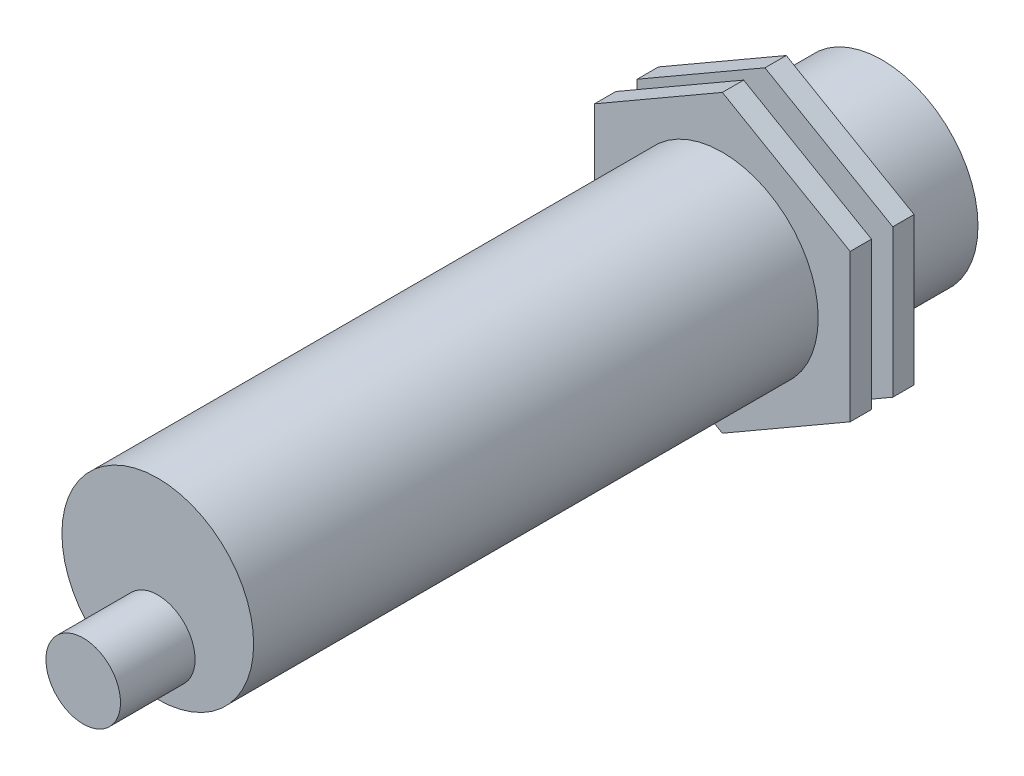
ISO-10303-21;
HEADER;
FILE_DESCRIPTION(('STEP AP214'),'2;1');
FILE_NAME('part.step','',(''),(''),'','','');
FILE_SCHEMA(('AUTOMOTIVE_DESIGN { 1 0 10303 214 1 1 1 1 }'));
ENDSEC;
DATA;
#1=APPLICATION_CONTEXT('core data for automotive mechanical design processes');
#2=APPLICATION_PROTOCOL_DEFINITION('international standard','automotive_design',2000,#1);
#3=PRODUCT_CONTEXT('',#1,'mechanical');
#4=PRODUCT('Part','Part','',(#3));
#5=PRODUCT_RELATED_PRODUCT_CATEGORY('part','',(#4));
#6=PRODUCT_DEFINITION_FORMATION('','',#4);
#7=PRODUCT_DEFINITION_CONTEXT('part definition',#1,'design');
#8=PRODUCT_DEFINITION('design','',#6,#7);
#9=PRODUCT_DEFINITION_SHAPE('','',#8);
#10=(LENGTH_UNIT() NAMED_UNIT(*) SI_UNIT(.MILLI.,.METRE.));
#11=(NAMED_UNIT(*) PLANE_ANGLE_UNIT() SI_UNIT($,.RADIAN.));
#12=(NAMED_UNIT(*) SI_UNIT($,.STERADIAN.) SOLID_ANGLE_UNIT());
#13=UNCERTAINTY_MEASURE_WITH_UNIT(LENGTH_MEASURE(1.E-05),#10,'distance_accuracy_value','');
#14=(GEOMETRIC_REPRESENTATION_CONTEXT(3) GLOBAL_UNCERTAINTY_ASSIGNED_CONTEXT((#13)) GLOBAL_UNIT_ASSIGNED_CONTEXT((#10,
#11,#12)) REPRESENTATION_CONTEXT('',''));
#15=CARTESIAN_POINT('',(0.,0.,0.));
#16=DIRECTION('',(0.,0.,1.));
#17=DIRECTION('',(1.,0.,0.));
#18=AXIS2_PLACEMENT_3D('',#15,#16,#17);
#19=CARTESIAN_POINT('',(0.,0.,68.));
#20=DIRECTION('',(0.,0.,-1.));
#21=DIRECTION('',(-1.,0.,0.));
#22=AXIS2_PLACEMENT_3D('',#19,#20,#21);
#23=CYLINDRICAL_SURFACE('',#22,9.);
#24=CARTESIAN_POINT('',(0.,0.,13.));
#25=DIRECTION('',(0.,0.,-1.));
#26=DIRECTION('',(-1.,0.,0.));
#27=AXIS2_PLACEMENT_3D('',#24,#25,#26);
#28=CIRCLE('',#27,9.);
#29=CARTESIAN_POINT('',(-9.,0.,13.));
#30=VERTEX_POINT('',#29);
#31=EDGE_CURVE('E47',#30,#30,#28,.T.);
#32=ORIENTED_EDGE('',*,*,#31,.T.);
#33=EDGE_LOOP('',(#32));
#34=FACE_BOUND('',#33,.T.);
#35=CARTESIAN_POINT('',(0.,0.,11.));
#36=DIRECTION('',(0.,0.,-1.));
#37=DIRECTION('',(-1.,0.,0.));
#38=AXIS2_PLACEMENT_3D('',#35,#36,#37);
#39=CIRCLE('',#38,9.);
#40=CARTESIAN_POINT('',(-9.,0.,11.));
#41=VERTEX_POINT('',#40);
#42=EDGE_CURVE('E54',#41,#41,#39,.T.);
#43=ORIENTED_EDGE('',*,*,#42,.F.);
#44=EDGE_LOOP('',(#43));
#45=FACE_BOUND('',#44,.T.);
#46=ADVANCED_FACE('F43',(#34,#45),#23,.T.);
#47=CARTESIAN_POINT('',(0.,13.856406460551,11.));
#48=DIRECTION('',(0.499999999999998,0.86602540378444,0.));
#49=DIRECTION('',(-0.86602540378444,0.499999999999998,0.));
#50=AXIS2_PLACEMENT_3D('',#47,#48,#49);
#51=PLANE('',#50);
#52=DIRECTION('',(0.86602540378444,-0.499999999999998,0.));
#53=VECTOR('',#52,1.);
#54=CARTESIAN_POINT('',(0.,13.856406460551,9.));
#55=LINE('',#54,#53);
#56=CARTESIAN_POINT('',(0.,13.856406460551,9.));
#57=VERTEX_POINT('',#56);
#58=CARTESIAN_POINT('',(12.,6.92820323027549,9.));
#59=VERTEX_POINT('',#58);
#60=EDGE_CURVE('E142',#57,#59,#55,.T.);
#61=ORIENTED_EDGE('',*,*,#60,.F.);
#62=DIRECTION('',(0.,0.,-1.));
#63=VECTOR('',#62,1.);
#64=CARTESIAN_POINT('',(0.,13.856406460551,11.));
#65=LINE('',#64,#63);
#66=CARTESIAN_POINT('',(0.,13.856406460551,11.));
#67=VERTEX_POINT('',#66);
#68=EDGE_CURVE('E62',#67,#57,#65,.T.);
#69=ORIENTED_EDGE('',*,*,#68,.F.);
#70=DIRECTION('',(0.86602540378444,-0.499999999999998,0.));
#71=VECTOR('',#70,1.);
#72=CARTESIAN_POINT('',(0.,13.856406460551,11.));
#73=LINE('',#72,#71);
#74=CARTESIAN_POINT('',(12.,6.92820323027549,11.));
#75=VERTEX_POINT('',#74);
#76=EDGE_CURVE('E163',#67,#75,#73,.T.);
#77=ORIENTED_EDGE('',*,*,#76,.T.);
#78=DIRECTION('',(0.,0.,-1.));
#79=VECTOR('',#78,1.);
#80=CARTESIAN_POINT('',(12.,6.92820323027549,11.));
#81=LINE('',#80,#79);
#82=EDGE_CURVE('E98',#75,#59,#81,.T.);
#83=ORIENTED_EDGE('',*,*,#82,.T.);
#84=EDGE_LOOP('',(#61,#69,#77,#83));
#85=FACE_BOUND('',#84,.T.);
#86=ADVANCED_FACE('F201',(#85),#51,.T.);
#87=CARTESIAN_POINT('',(-12.,6.9282032302755,11.));
#88=DIRECTION('',(-0.499999999999997,0.86602540378444,0.));
#89=DIRECTION('',(-0.86602540378444,-0.499999999999997,0.));
#90=AXIS2_PLACEMENT_3D('',#87,#88,#89);
#91=PLANE('',#90);
#92=DIRECTION('',(0.86602540378444,0.499999999999997,0.));
#93=VECTOR('',#92,1.);
#94=CARTESIAN_POINT('',(-12.,6.9282032302755,9.));
#95=LINE('',#94,#93);
#96=CARTESIAN_POINT('',(-12.,6.9282032302755,9.));
#97=VERTEX_POINT('',#96);
#98=EDGE_CURVE('E159',#97,#57,#95,.T.);
#99=ORIENTED_EDGE('',*,*,#98,.F.);
#100=DIRECTION('',(0.,0.,-1.));
#101=VECTOR('',#100,1.);
#102=CARTESIAN_POINT('',(-12.,6.9282032302755,11.));
#103=LINE('',#102,#101);
#104=CARTESIAN_POINT('',(-12.,6.9282032302755,11.));
#105=VERTEX_POINT('',#104);
#106=EDGE_CURVE('E86',#105,#97,#103,.T.);
#107=ORIENTED_EDGE('',*,*,#106,.F.);
#108=DIRECTION('',(0.86602540378444,0.499999999999997,0.));
#109=VECTOR('',#108,1.);
#110=CARTESIAN_POINT('',(-12.,6.9282032302755,11.));
#111=LINE('',#110,#109);
#112=EDGE_CURVE('E128',#105,#67,#111,.T.);
#113=ORIENTED_EDGE('',*,*,#112,.T.);
#114=ORIENTED_EDGE('',*,*,#68,.T.);
#115=EDGE_LOOP('',(#99,#107,#113,#114));
#116=FACE_BOUND('',#115,.T.);
#117=ADVANCED_FACE('F209',(#116),#91,.T.);
#118=CARTESIAN_POINT('',(-12.,-6.92820323027549,11.));
#119=DIRECTION('',(-1.,0.,0.));
#120=DIRECTION('',(0.,0.,1.));
#121=AXIS2_PLACEMENT_3D('',#118,#119,#120);
#122=PLANE('',#121);
#123=DIRECTION('',(0.,1.,0.));
#124=VECTOR('',#123,1.);
#125=CARTESIAN_POINT('',(-12.,-6.92820323027549,9.));
#126=LINE('',#125,#124);
#127=CARTESIAN_POINT('',(-12.,-6.92820323027549,9.));
#128=VERTEX_POINT('',#127);
#129=EDGE_CURVE('E114',#128,#97,#126,.T.);
#130=ORIENTED_EDGE('',*,*,#129,.F.);
#131=DIRECTION('',(0.,0.,-1.));
#132=VECTOR('',#131,1.);
#133=CARTESIAN_POINT('',(-12.,-6.92820323027549,11.));
#134=LINE('',#133,#132);
#135=CARTESIAN_POINT('',(-12.,-6.92820323027549,11.));
#136=VERTEX_POINT('',#135);
#137=EDGE_CURVE('E109',#136,#128,#134,.T.);
#138=ORIENTED_EDGE('',*,*,#137,.F.);
#139=DIRECTION('',(0.,1.,0.));
#140=VECTOR('',#139,1.);
#141=CARTESIAN_POINT('',(-12.,-6.92820323027549,11.));
#142=LINE('',#141,#140);
#143=EDGE_CURVE('E112',#136,#105,#142,.T.);
#144=ORIENTED_EDGE('',*,*,#143,.T.);
#145=ORIENTED_EDGE('',*,*,#106,.T.);
#146=EDGE_LOOP('',(#130,#138,#144,#145));
#147=FACE_BOUND('',#146,.T.);
#148=ADVANCED_FACE('F111',(#147),#122,.T.);
#149=CARTESIAN_POINT('',(0.,-13.856406460551,11.));
#150=DIRECTION('',(-0.499999999999998,-0.86602540378444,0.));
#151=DIRECTION('',(0.86602540378444,-0.499999999999998,0.));
#152=AXIS2_PLACEMENT_3D('',#149,#150,#151);
#153=PLANE('',#152);
#154=DIRECTION('',(-0.86602540378444,0.499999999999998,0.));
#155=VECTOR('',#154,1.);
#156=CARTESIAN_POINT('',(0.,-13.856406460551,9.));
#157=LINE('',#156,#155);
#158=CARTESIAN_POINT('',(0.,-13.856406460551,9.));
#159=VERTEX_POINT('',#158);
#160=EDGE_CURVE('E154',#159,#128,#157,.T.);
#161=ORIENTED_EDGE('',*,*,#160,.F.);
#162=DIRECTION('',(0.,0.,-1.));
#163=VECTOR('',#162,1.);
#164=CARTESIAN_POINT('',(0.,-13.856406460551,11.));
#165=LINE('',#164,#163);
#166=CARTESIAN_POINT('',(0.,-13.856406460551,11.));
#167=VERTEX_POINT('',#166);
#168=EDGE_CURVE('E120',#167,#159,#165,.T.);
#169=ORIENTED_EDGE('',*,*,#168,.F.);
#170=DIRECTION('',(-0.86602540378444,0.499999999999998,0.));
#171=VECTOR('',#170,1.);
#172=CARTESIAN_POINT('',(0.,-13.856406460551,11.));
#173=LINE('',#172,#171);
#174=EDGE_CURVE('E126',#167,#136,#173,.T.);
#175=ORIENTED_EDGE('',*,*,#174,.T.);
#176=ORIENTED_EDGE('',*,*,#137,.T.);
#177=EDGE_LOOP('',(#161,#169,#175,#176));
#178=FACE_BOUND('',#177,.T.);
#179=ADVANCED_FACE('F131',(#178),#153,.T.);
#180=CARTESIAN_POINT('',(12.,-6.9282032302755,11.));
#181=DIRECTION('',(0.499999999999997,-0.86602540378444,0.));
#182=DIRECTION('',(0.86602540378444,0.499999999999997,0.));
#183=AXIS2_PLACEMENT_3D('',#180,#181,#182);
#184=PLANE('',#183);
#185=DIRECTION('',(-0.86602540378444,-0.499999999999997,0.));
#186=VECTOR('',#185,1.);
#187=CARTESIAN_POINT('',(12.,-6.9282032302755,9.));
#188=LINE('',#187,#186);
#189=CARTESIAN_POINT('',(12.,-6.9282032302755,9.));
#190=VERTEX_POINT('',#189);
#191=EDGE_CURVE('E150',#190,#159,#188,.T.);
#192=ORIENTED_EDGE('',*,*,#191,.F.);
#193=DIRECTION('',(0.,0.,-1.));
#194=VECTOR('',#193,1.);
#195=CARTESIAN_POINT('',(12.,-6.9282032302755,11.));
#196=LINE('',#195,#194);
#197=CARTESIAN_POINT('',(12.,-6.9282032302755,11.));
#198=VERTEX_POINT('',#197);
#199=EDGE_CURVE('E171',#198,#190,#196,.T.);
#200=ORIENTED_EDGE('',*,*,#199,.F.);
#201=DIRECTION('',(-0.86602540378444,-0.499999999999997,0.));
#202=VECTOR('',#201,1.);
#203=CARTESIAN_POINT('',(12.,-6.9282032302755,11.));
#204=LINE('',#203,#202);
#205=EDGE_CURVE('E133',#198,#167,#204,.T.);
#206=ORIENTED_EDGE('',*,*,#205,.T.);
#207=ORIENTED_EDGE('',*,*,#168,.T.);
#208=EDGE_LOOP('',(#192,#200,#206,#207));
#209=FACE_BOUND('',#208,.T.);
#210=ADVANCED_FACE('F315',(#209),#184,.T.);
#211=CARTESIAN_POINT('',(12.,6.92820323027549,11.));
#212=DIRECTION('',(1.,0.,0.));
#213=DIRECTION('',(0.,0.,-1.));
#214=AXIS2_PLACEMENT_3D('',#211,#212,#213);
#215=PLANE('',#214);
#216=DIRECTION('',(0.,-1.,0.));
#217=VECTOR('',#216,1.);
#218=CARTESIAN_POINT('',(12.,6.92820323027549,9.));
#219=LINE('',#218,#217);
#220=EDGE_CURVE('E146',#59,#190,#219,.T.);
#221=ORIENTED_EDGE('',*,*,#220,.F.);
#222=ORIENTED_EDGE('',*,*,#82,.F.);
#223=DIRECTION('',(0.,-1.,0.));
#224=VECTOR('',#223,1.);
#225=CARTESIAN_POINT('',(12.,6.92820323027549,11.));
#226=LINE('',#225,#224);
#227=EDGE_CURVE('E136',#75,#198,#226,.T.);
#228=ORIENTED_EDGE('',*,*,#227,.T.);
#229=ORIENTED_EDGE('',*,*,#199,.T.);
#230=EDGE_LOOP('',(#221,#222,#228,#229));
#231=FACE_BOUND('',#230,.T.);
#232=ADVANCED_FACE('F300',(#231),#215,.T.);
#233=CARTESIAN_POINT('',(0.,0.,11.));
#234=DIRECTION('',(0.,0.,-1.));
#235=DIRECTION('',(-1.,0.,0.));
#236=AXIS2_PLACEMENT_3D('',#233,#234,#235);
#237=PLANE('',#236);
#238=ORIENTED_EDGE('',*,*,#42,.T.);
#239=EDGE_LOOP('',(#238));
#240=FACE_BOUND('',#239,.T.);
#241=ORIENTED_EDGE('',*,*,#76,.F.);
#242=ORIENTED_EDGE('',*,*,#112,.F.);
#243=ORIENTED_EDGE('',*,*,#143,.F.);
#244=ORIENTED_EDGE('',*,*,#174,.F.);
#245=ORIENTED_EDGE('',*,*,#205,.F.);
#246=ORIENTED_EDGE('',*,*,#227,.F.);
#247=EDGE_LOOP('',(#241,#242,#243,#244,#245,#246));
#248=FACE_BOUND('',#247,.T.);
#249=ADVANCED_FACE('F124',(#240,#248),#237,.F.);
#250=CARTESIAN_POINT('',(0.,0.,9.));
#251=DIRECTION('',(0.,0.,-1.));
#252=DIRECTION('',(-1.,0.,0.));
#253=AXIS2_PLACEMENT_3D('',#250,#251,#252);
#254=PLANE('',#253);
#255=CARTESIAN_POINT('',(0.,0.,9.));
#256=DIRECTION('',(0.,0.,-1.));
#257=DIRECTION('',(-1.,0.,0.));
#258=AXIS2_PLACEMENT_3D('',#255,#256,#257);
#259=CIRCLE('',#258,9.);
#260=CARTESIAN_POINT('',(-9.,0.,9.));
#261=VERTEX_POINT('',#260);
#262=EDGE_CURVE('E166',#261,#261,#259,.T.);
#263=ORIENTED_EDGE('',*,*,#262,.F.);
#264=EDGE_LOOP('',(#263));
#265=FACE_BOUND('',#264,.T.);
#266=ORIENTED_EDGE('',*,*,#60,.T.);
#267=ORIENTED_EDGE('',*,*,#220,.T.);
#268=ORIENTED_EDGE('',*,*,#191,.T.);
#269=ORIENTED_EDGE('',*,*,#160,.T.);
#270=ORIENTED_EDGE('',*,*,#129,.T.);
#271=ORIENTED_EDGE('',*,*,#98,.T.);
#272=EDGE_LOOP('',(#266,#267,#268,#269,#270,#271));
#273=FACE_BOUND('',#272,.T.);
#274=ADVANCED_FACE('F303',(#265,#273),#254,.T.);
#275=CARTESIAN_POINT('',(0.,0.,0.));
#276=DIRECTION('',(0.,0.,1.));
#277=DIRECTION('',(1.,0.,0.));
#278=AXIS2_PLACEMENT_3D('',#275,#276,#277);
#279=PLANE('',#278);
#280=CARTESIAN_POINT('',(0.,0.,0.));
#281=DIRECTION('',(0.,0.,1.));
#282=DIRECTION('',(1.,0.,0.));
#283=AXIS2_PLACEMENT_3D('',#280,#281,#282);
#284=CIRCLE('',#283,9.);
#285=CARTESIAN_POINT('',(9.,0.,0.));
#286=VERTEX_POINT('',#285);
#287=EDGE_CURVE('E180',#286,#286,#284,.T.);
#288=ORIENTED_EDGE('',*,*,#287,.F.);
#289=EDGE_LOOP('',(#288));
#290=FACE_BOUND('',#289,.T.);
#291=ADVANCED_FACE('F213',(#290),#279,.F.);
#292=ORIENTED_EDGE('',*,*,#262,.T.);
#293=EDGE_LOOP('',(#292));
#294=FACE_BOUND('',#293,.T.);
#295=ORIENTED_EDGE('',*,*,#287,.T.);
#296=EDGE_LOOP('',(#295));
#297=FACE_BOUND('',#296,.T.);
#298=ADVANCED_FACE('F45',(#294,#297),#23,.T.);
#299=CARTESIAN_POINT('',(0.,13.856406460551,13.));
#300=DIRECTION('',(-0.499999999999998,-0.86602540378444,0.));
#301=DIRECTION('',(0.86602540378444,-0.499999999999998,0.));
#302=AXIS2_PLACEMENT_3D('',#299,#300,#301);
#303=PLANE('',#302);
#304=DIRECTION('',(0.86602540378444,-0.499999999999998,0.));
#305=VECTOR('',#304,1.);
#306=CARTESIAN_POINT('',(0.,13.856406460551,15.));
#307=LINE('',#306,#305);
#308=CARTESIAN_POINT('',(0.,13.856406460551,15.));
#309=VERTEX_POINT('',#308);
#310=CARTESIAN_POINT('',(12.,6.92820323027549,15.));
#311=VERTEX_POINT('',#310);
#312=EDGE_CURVE('E239',#309,#311,#307,.T.);
#313=ORIENTED_EDGE('',*,*,#312,.T.);
#314=DIRECTION('',(0.,0.,1.));
#315=VECTOR('',#314,1.);
#316=CARTESIAN_POINT('',(12.,6.92820323027549,13.));
#317=LINE('',#316,#315);
#318=CARTESIAN_POINT('',(12.,6.92820323027549,13.));
#319=VERTEX_POINT('',#318);
#320=EDGE_CURVE('E295',#319,#311,#317,.T.);
#321=ORIENTED_EDGE('',*,*,#320,.F.);
#322=DIRECTION('',(0.86602540378444,-0.499999999999998,0.));
#323=VECTOR('',#322,1.);
#324=CARTESIAN_POINT('',(0.,13.856406460551,13.));
#325=LINE('',#324,#323);
#326=CARTESIAN_POINT('',(0.,13.856406460551,13.));
#327=VERTEX_POINT('',#326);
#328=EDGE_CURVE('E275',#327,#319,#325,.T.);
#329=ORIENTED_EDGE('',*,*,#328,.F.);
#330=DIRECTION('',(0.,0.,1.));
#331=VECTOR('',#330,1.);
#332=CARTESIAN_POINT('',(0.,13.856406460551,13.));
#333=LINE('',#332,#331);
#334=EDGE_CURVE('E276',#327,#309,#333,.T.);
#335=ORIENTED_EDGE('',*,*,#334,.T.);
#336=EDGE_LOOP('',(#313,#321,#329,#335));
#337=FACE_BOUND('',#336,.T.);
#338=ADVANCED_FACE('F212',(#337),#303,.F.);
#339=CARTESIAN_POINT('',(12.,6.92820323027549,13.));
#340=DIRECTION('',(-1.,0.,0.));
#341=DIRECTION('',(0.,0.,1.));
#342=AXIS2_PLACEMENT_3D('',#339,#340,#341);
#343=PLANE('',#342);
#344=DIRECTION('',(0.,-1.,0.));
#345=VECTOR('',#344,1.);
#346=CARTESIAN_POINT('',(12.,6.92820323027549,15.));
#347=LINE('',#346,#345);
#348=CARTESIAN_POINT('',(12.,-6.9282032302755,15.));
#349=VERTEX_POINT('',#348);
#350=EDGE_CURVE('E247',#311,#349,#347,.T.);
#351=ORIENTED_EDGE('',*,*,#350,.T.);
#352=DIRECTION('',(0.,0.,1.));
#353=VECTOR('',#352,1.);
#354=CARTESIAN_POINT('',(12.,-6.9282032302755,13.));
#355=LINE('',#354,#353);
#356=CARTESIAN_POINT('',(12.,-6.9282032302755,13.));
#357=VERTEX_POINT('',#356);
#358=EDGE_CURVE('E291',#357,#349,#355,.T.);
#359=ORIENTED_EDGE('',*,*,#358,.F.);
#360=DIRECTION('',(0.,-1.,0.));
#361=VECTOR('',#360,1.);
#362=CARTESIAN_POINT('',(12.,6.92820323027549,13.));
#363=LINE('',#362,#361);
#364=EDGE_CURVE('E376',#319,#357,#363,.T.);
#365=ORIENTED_EDGE('',*,*,#364,.F.);
#366=ORIENTED_EDGE('',*,*,#320,.T.);
#367=EDGE_LOOP('',(#351,#359,#365,#366));
#368=FACE_BOUND('',#367,.T.);
#369=ADVANCED_FACE('F343',(#368),#343,.F.);
#370=CARTESIAN_POINT('',(12.,-6.9282032302755,13.));
#371=DIRECTION('',(-0.499999999999997,0.86602540378444,0.));
#372=DIRECTION('',(-0.86602540378444,-0.499999999999997,0.));
#373=AXIS2_PLACEMENT_3D('',#370,#371,#372);
#374=PLANE('',#373);
#375=DIRECTION('',(-0.86602540378444,-0.499999999999997,0.));
#376=VECTOR('',#375,1.);
#377=CARTESIAN_POINT('',(12.,-6.9282032302755,15.));
#378=LINE('',#377,#376);
#379=CARTESIAN_POINT('',(0.,-13.856406460551,15.));
#380=VERTEX_POINT('',#379);
#381=EDGE_CURVE('E256',#349,#380,#378,.T.);
#382=ORIENTED_EDGE('',*,*,#381,.T.);
#383=DIRECTION('',(0.,0.,1.));
#384=VECTOR('',#383,1.);
#385=CARTESIAN_POINT('',(0.,-13.856406460551,13.));
#386=LINE('',#385,#384);
#387=CARTESIAN_POINT('',(0.,-13.856406460551,13.));
#388=VERTEX_POINT('',#387);
#389=EDGE_CURVE('E287',#388,#380,#386,.T.);
#390=ORIENTED_EDGE('',*,*,#389,.F.);
#391=DIRECTION('',(-0.86602540378444,-0.499999999999997,0.));
#392=VECTOR('',#391,1.);
#393=CARTESIAN_POINT('',(12.,-6.9282032302755,13.));
#394=LINE('',#393,#392);
#395=EDGE_CURVE('E405',#357,#388,#394,.T.);
#396=ORIENTED_EDGE('',*,*,#395,.F.);
#397=ORIENTED_EDGE('',*,*,#358,.T.);
#398=EDGE_LOOP('',(#382,#390,#396,#397));
#399=FACE_BOUND('',#398,.T.);
#400=ADVANCED_FACE('F346',(#399),#374,.F.);
#401=CARTESIAN_POINT('',(0.,-13.856406460551,13.));
#402=DIRECTION('',(0.499999999999998,0.86602540378444,0.));
#403=DIRECTION('',(-0.86602540378444,0.499999999999998,0.));
#404=AXIS2_PLACEMENT_3D('',#401,#402,#403);
#405=PLANE('',#404);
#406=DIRECTION('',(-0.86602540378444,0.499999999999998,0.));
#407=VECTOR('',#406,1.);
#408=CARTESIAN_POINT('',(0.,-13.856406460551,15.));
#409=LINE('',#408,#407);
#410=CARTESIAN_POINT('',(-12.,-6.92820323027549,15.));
#411=VERTEX_POINT('',#410);
#412=EDGE_CURVE('E265',#380,#411,#409,.T.);
#413=ORIENTED_EDGE('',*,*,#412,.T.);
#414=DIRECTION('',(0.,0.,1.));
#415=VECTOR('',#414,1.);
#416=CARTESIAN_POINT('',(-12.,-6.92820323027549,13.));
#417=LINE('',#416,#415);
#418=CARTESIAN_POINT('',(-12.,-6.92820323027549,13.));
#419=VERTEX_POINT('',#418);
#420=EDGE_CURVE('E283',#419,#411,#417,.T.);
#421=ORIENTED_EDGE('',*,*,#420,.F.);
#422=DIRECTION('',(-0.86602540378444,0.499999999999998,0.));
#423=VECTOR('',#422,1.);
#424=CARTESIAN_POINT('',(0.,-13.856406460551,13.));
#425=LINE('',#424,#423);
#426=EDGE_CURVE('E402',#388,#419,#425,.T.);
#427=ORIENTED_EDGE('',*,*,#426,.F.);
#428=ORIENTED_EDGE('',*,*,#389,.T.);
#429=EDGE_LOOP('',(#413,#421,#427,#428));
#430=FACE_BOUND('',#429,.T.);
#431=ADVANCED_FACE('F350',(#430),#405,.F.);
#432=CARTESIAN_POINT('',(-12.,-6.92820323027549,13.));
#433=DIRECTION('',(1.,0.,0.));
#434=DIRECTION('',(0.,0.,-1.));
#435=AXIS2_PLACEMENT_3D('',#432,#433,#434);
#436=PLANE('',#435);
#437=DIRECTION('',(0.,1.,0.));
#438=VECTOR('',#437,1.);
#439=CARTESIAN_POINT('',(-12.,-6.92820323027549,15.));
#440=LINE('',#439,#438);
#441=CARTESIAN_POINT('',(-12.,6.9282032302755,15.));
#442=VERTEX_POINT('',#441);
#443=EDGE_CURVE('E269',#411,#442,#440,.T.);
#444=ORIENTED_EDGE('',*,*,#443,.T.);
#445=DIRECTION('',(0.,0.,1.));
#446=VECTOR('',#445,1.);
#447=CARTESIAN_POINT('',(-12.,6.9282032302755,13.));
#448=LINE('',#447,#446);
#449=CARTESIAN_POINT('',(-12.,6.9282032302755,13.));
#450=VERTEX_POINT('',#449);
#451=EDGE_CURVE('E279',#450,#442,#448,.T.);
#452=ORIENTED_EDGE('',*,*,#451,.F.);
#453=DIRECTION('',(0.,1.,0.));
#454=VECTOR('',#453,1.);
#455=CARTESIAN_POINT('',(-12.,-6.92820323027549,13.));
#456=LINE('',#455,#454);
#457=EDGE_CURVE('E400',#419,#450,#456,.T.);
#458=ORIENTED_EDGE('',*,*,#457,.F.);
#459=ORIENTED_EDGE('',*,*,#420,.T.);
#460=EDGE_LOOP('',(#444,#452,#458,#459));
#461=FACE_BOUND('',#460,.T.);
#462=ADVANCED_FACE('F354',(#461),#436,.F.);
#463=CARTESIAN_POINT('',(-12.,6.9282032302755,13.));
#464=DIRECTION('',(0.499999999999997,-0.86602540378444,0.));
#465=DIRECTION('',(0.86602540378444,0.499999999999997,0.));
#466=AXIS2_PLACEMENT_3D('',#463,#464,#465);
#467=PLANE('',#466);
#468=DIRECTION('',(0.86602540378444,0.499999999999997,0.));
#469=VECTOR('',#468,1.);
#470=CARTESIAN_POINT('',(-12.,6.9282032302755,15.));
#471=LINE('',#470,#469);
#472=EDGE_CURVE('E243',#442,#309,#471,.T.);
#473=ORIENTED_EDGE('',*,*,#472,.T.);
#474=ORIENTED_EDGE('',*,*,#334,.F.);
#475=DIRECTION('',(0.86602540378444,0.499999999999997,0.));
#476=VECTOR('',#475,1.);
#477=CARTESIAN_POINT('',(-12.,6.9282032302755,13.));
#478=LINE('',#477,#476);
#479=EDGE_CURVE('E259',#450,#327,#478,.T.);
#480=ORIENTED_EDGE('',*,*,#479,.F.);
#481=ORIENTED_EDGE('',*,*,#451,.T.);
#482=EDGE_LOOP('',(#473,#474,#480,#481));
#483=FACE_BOUND('',#482,.T.);
#484=ADVANCED_FACE('F358',(#483),#467,.F.);
#485=CARTESIAN_POINT('',(0.,0.,13.));
#486=DIRECTION('',(0.,0.,-1.));
#487=DIRECTION('',(-1.,0.,0.));
#488=AXIS2_PLACEMENT_3D('',#485,#486,#487);
#489=PLANE('',#488);
#490=ORIENTED_EDGE('',*,*,#31,.F.);
#491=EDGE_LOOP('',(#490));
#492=FACE_BOUND('',#491,.T.);
#493=ORIENTED_EDGE('',*,*,#328,.T.);
#494=ORIENTED_EDGE('',*,*,#364,.T.);
#495=ORIENTED_EDGE('',*,*,#395,.T.);
#496=ORIENTED_EDGE('',*,*,#426,.T.);
#497=ORIENTED_EDGE('',*,*,#457,.T.);
#498=ORIENTED_EDGE('',*,*,#479,.T.);
#499=EDGE_LOOP('',(#493,#494,#495,#496,#497,#498));
#500=FACE_BOUND('',#499,.T.);
#501=ADVANCED_FACE('F233',(#492,#500),#489,.T.);
#502=CARTESIAN_POINT('',(0.,0.,15.));
#503=DIRECTION('',(0.,0.,-1.));
#504=DIRECTION('',(-1.,0.,0.));
#505=AXIS2_PLACEMENT_3D('',#502,#503,#504);
#506=PLANE('',#505);
#507=CARTESIAN_POINT('',(0.,0.,15.));
#508=DIRECTION('',(0.,0.,-1.));
#509=DIRECTION('',(-1.,0.,0.));
#510=AXIS2_PLACEMENT_3D('',#507,#508,#509);
#511=CIRCLE('',#510,9.);
#512=CARTESIAN_POINT('',(-9.,0.,15.));
#513=VERTEX_POINT('',#512);
#514=EDGE_CURVE('E11',#513,#513,#511,.T.);
#515=ORIENTED_EDGE('',*,*,#514,.T.);
#516=EDGE_LOOP('',(#515));
#517=FACE_BOUND('',#516,.T.);
#518=ORIENTED_EDGE('',*,*,#312,.F.);
#519=ORIENTED_EDGE('',*,*,#472,.F.);
#520=ORIENTED_EDGE('',*,*,#443,.F.);
#521=ORIENTED_EDGE('',*,*,#412,.F.);
#522=ORIENTED_EDGE('',*,*,#381,.F.);
#523=ORIENTED_EDGE('',*,*,#350,.F.);
#524=EDGE_LOOP('',(#518,#519,#520,#521,#522,#523));
#525=FACE_BOUND('',#524,.T.);
#526=ADVANCED_FACE('F229',(#517,#525),#506,.F.);
#527=CARTESIAN_POINT('',(0.,-4.,75.));
#528=DIRECTION('',(0.,0.,1.));
#529=DIRECTION('',(1.,0.,0.));
#530=AXIS2_PLACEMENT_3D('',#527,#528,#529);
#531=PLANE('',#530);
#532=CARTESIAN_POINT('',(0.,-4.,75.));
#533=DIRECTION('',(0.,0.,1.));
#534=DIRECTION('',(1.,0.,0.));
#535=AXIS2_PLACEMENT_3D('',#532,#533,#534);
#536=CIRCLE('',#535,3.5);
#537=CARTESIAN_POINT('',(3.5,-4.,75.));
#538=VERTEX_POINT('',#537);
#539=EDGE_CURVE('E176',#538,#538,#536,.T.);
#540=ORIENTED_EDGE('',*,*,#539,.T.);
#541=EDGE_LOOP('',(#540));
#542=FACE_BOUND('',#541,.T.);
#543=ADVANCED_FACE('F232',(#542),#531,.T.);
#544=CARTESIAN_POINT('',(0.,-4.,75.));
#545=DIRECTION('',(0.,0.,-1.));
#546=DIRECTION('',(-1.,0.,0.));
#547=AXIS2_PLACEMENT_3D('',#544,#545,#546);
#548=CYLINDRICAL_SURFACE('',#547,3.5);
#549=ORIENTED_EDGE('',*,*,#539,.F.);
#550=EDGE_LOOP('',(#549));
#551=FACE_BOUND('',#550,.T.);
#552=CARTESIAN_POINT('',(0.,-4.,68.));
#553=DIRECTION('',(0.,0.,1.));
#554=DIRECTION('',(1.,0.,0.));
#555=AXIS2_PLACEMENT_3D('',#552,#553,#554);
#556=CIRCLE('',#555,3.5);
#557=CARTESIAN_POINT('',(3.5,-4.,68.));
#558=VERTEX_POINT('',#557);
#559=EDGE_CURVE('E181',#558,#558,#556,.T.);
#560=ORIENTED_EDGE('',*,*,#559,.T.);
#561=EDGE_LOOP('',(#560));
#562=FACE_BOUND('',#561,.T.);
#563=ADVANCED_FACE('F222',(#551,#562),#548,.T.);
#564=CARTESIAN_POINT('',(0.,0.,68.));
#565=DIRECTION('',(0.,0.,1.));
#566=DIRECTION('',(1.,0.,0.));
#567=AXIS2_PLACEMENT_3D('',#564,#565,#566);
#568=PLANE('',#567);
#569=ORIENTED_EDGE('',*,*,#559,.F.);
#570=EDGE_LOOP('',(#569));
#571=FACE_BOUND('',#570,.T.);
#572=CARTESIAN_POINT('',(0.,0.,68.));
#573=DIRECTION('',(0.,0.,1.));
#574=DIRECTION('',(1.,0.,0.));
#575=AXIS2_PLACEMENT_3D('',#572,#573,#574);
#576=CIRCLE('',#575,9.);
#577=CARTESIAN_POINT('',(9.,0.,68.));
#578=VERTEX_POINT('',#577);
#579=EDGE_CURVE('E185',#578,#578,#576,.T.);
#580=ORIENTED_EDGE('',*,*,#579,.T.);
#581=EDGE_LOOP('',(#580));
#582=FACE_BOUND('',#581,.T.);
#583=ADVANCED_FACE('F216',(#571,#582),#568,.T.);
#584=ORIENTED_EDGE('',*,*,#579,.F.);
#585=EDGE_LOOP('',(#584));
#586=FACE_BOUND('',#585,.T.);
#587=ORIENTED_EDGE('',*,*,#514,.F.);
#588=EDGE_LOOP('',(#587));
#589=FACE_BOUND('',#588,.T.);
#590=ADVANCED_FACE('F203',(#586,#589),#23,.T.);
#591=CLOSED_SHELL('',(#46,#86,#117,#148,#179,#210,#232,#249,#274,#291,#298,#338,#369,#400,#431,
#462,#484,#501,#526,#543,#563,#583,#590));
#592=MANIFOLD_SOLID_BREP('B2',#591);
#593=ADVANCED_BREP_SHAPE_REPRESENTATION('',(#18,#592),#14);
#594=SHAPE_DEFINITION_REPRESENTATION(#9,#593);
ENDSEC;
END-ISO-10303-21;
